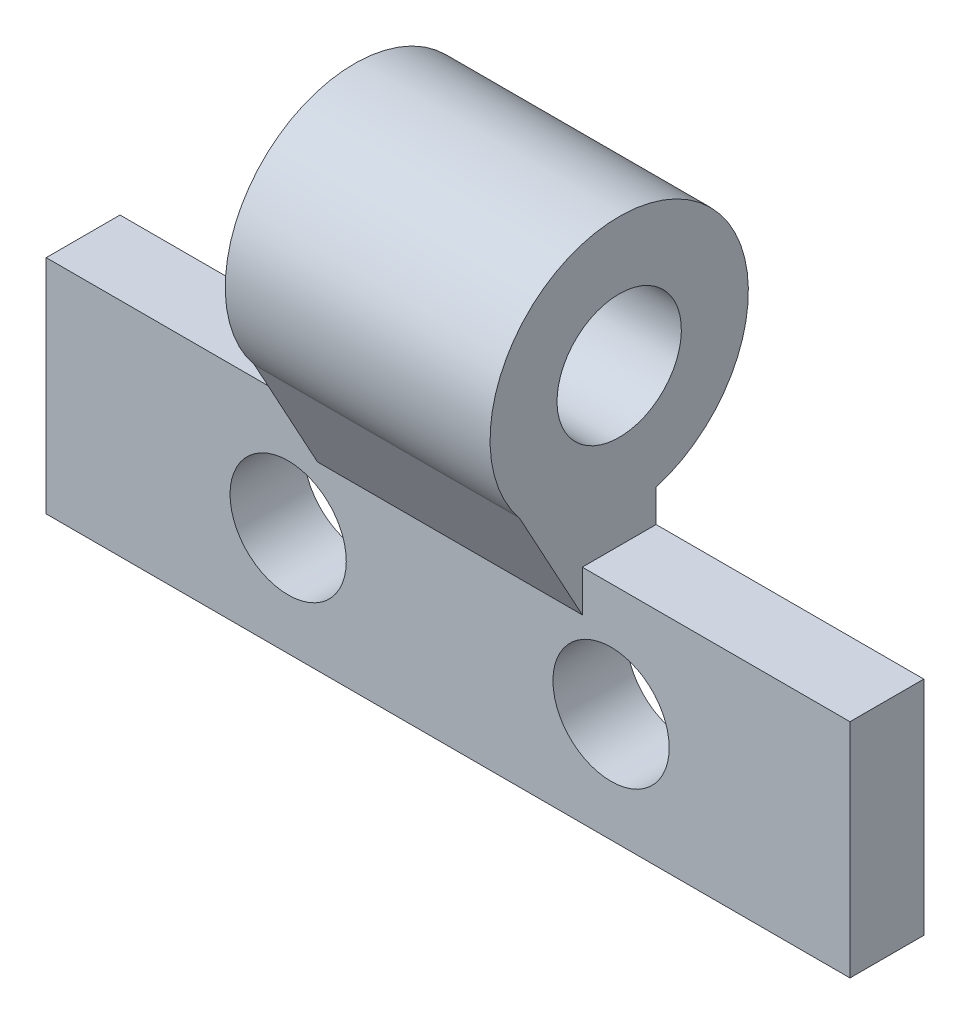
ISO-10303-21;
HEADER;
FILE_DESCRIPTION(('STEP AP214'),'2;1');
FILE_NAME('part.step','',(''),(''),'','','');
FILE_SCHEMA(('AUTOMOTIVE_DESIGN { 1 0 10303 214 1 1 1 1 }'));
ENDSEC;
DATA;
#1=APPLICATION_CONTEXT('core data for automotive mechanical design processes');
#2=APPLICATION_PROTOCOL_DEFINITION('international standard','automotive_design',2000,#1);
#3=PRODUCT_CONTEXT('',#1,'mechanical');
#4=PRODUCT('Part','Part','',(#3));
#5=PRODUCT_RELATED_PRODUCT_CATEGORY('part','',(#4));
#6=PRODUCT_DEFINITION_FORMATION('','',#4);
#7=PRODUCT_DEFINITION_CONTEXT('part definition',#1,'design');
#8=PRODUCT_DEFINITION('design','',#6,#7);
#9=PRODUCT_DEFINITION_SHAPE('','',#8);
#10=(LENGTH_UNIT() NAMED_UNIT(*) SI_UNIT(.MILLI.,.METRE.));
#11=(NAMED_UNIT(*) PLANE_ANGLE_UNIT() SI_UNIT($,.RADIAN.));
#12=(NAMED_UNIT(*) SI_UNIT($,.STERADIAN.) SOLID_ANGLE_UNIT());
#13=UNCERTAINTY_MEASURE_WITH_UNIT(LENGTH_MEASURE(1.E-05),#10,'distance_accuracy_value','');
#14=(GEOMETRIC_REPRESENTATION_CONTEXT(3) GLOBAL_UNCERTAINTY_ASSIGNED_CONTEXT((#13)) GLOBAL_UNIT_ASSIGNED_CONTEXT((#10,
#11,#12)) REPRESENTATION_CONTEXT('',''));
#15=CARTESIAN_POINT('',(0.,0.,0.));
#16=DIRECTION('',(0.,0.,1.));
#17=DIRECTION('',(1.,0.,0.));
#18=AXIS2_PLACEMENT_3D('',#15,#16,#17);
#19=CARTESIAN_POINT('',(-24.27796875,7.59378125,2.286));
#20=DIRECTION('',(1.,0.,0.));
#21=DIRECTION('',(0.,0.,-1.));
#22=AXIS2_PLACEMENT_3D('',#19,#20,#21);
#23=PLANE('',#22);
#24=DIRECTION('',(0.,-1.,0.));
#25=VECTOR('',#24,1.);
#26=CARTESIAN_POINT('',(-24.27796875,7.59378125,2.286));
#27=LINE('',#26,#25);
#28=CARTESIAN_POINT('',(-24.27796875,6.59378125,2.286));
#29=VERTEX_POINT('',#28);
#30=CARTESIAN_POINT('',(-24.27796875,-0.28021875,2.286));
#31=VERTEX_POINT('',#30);
#32=EDGE_CURVE('E130',#29,#31,#27,.T.);
#33=ORIENTED_EDGE('',*,*,#32,.F.);
#34=DIRECTION('',(0.,0.,1.));
#35=VECTOR('',#34,1.);
#36=CARTESIAN_POINT('',(-24.27796875,6.59378125,0.));
#37=LINE('',#36,#35);
#38=CARTESIAN_POINT('',(-24.27796875,6.59378125,0.));
#39=VERTEX_POINT('',#38);
#40=EDGE_CURVE('E168',#39,#29,#37,.T.);
#41=ORIENTED_EDGE('',*,*,#40,.F.);
#42=DIRECTION('',(0.,-1.,0.));
#43=VECTOR('',#42,1.);
#44=CARTESIAN_POINT('',(-24.27796875,7.59378125,0.));
#45=LINE('',#44,#43);
#46=CARTESIAN_POINT('',(-24.27796875,-0.28021875,0.));
#47=VERTEX_POINT('',#46);
#48=EDGE_CURVE('E132',#39,#47,#45,.T.);
#49=ORIENTED_EDGE('',*,*,#48,.T.);
#50=DIRECTION('',(0.,0.,-1.));
#51=VECTOR('',#50,1.);
#52=CARTESIAN_POINT('',(-24.27796875,-0.28021875,2.286));
#53=LINE('',#52,#51);
#54=EDGE_CURVE('E137',#31,#47,#53,.T.);
#55=ORIENTED_EDGE('',*,*,#54,.F.);
#56=EDGE_LOOP('',(#33,#41,#49,#55));
#57=FACE_BOUND('',#56,.T.);
#58=ADVANCED_FACE('F33',(#57),#23,.F.);
#59=CARTESIAN_POINT('',(-24.27796875,-0.28021875,2.286));
#60=DIRECTION('',(0.,1.,0.));
#61=DIRECTION('',(0.,0.,1.));
#62=AXIS2_PLACEMENT_3D('',#59,#60,#61);
#63=PLANE('',#62);
#64=DIRECTION('',(1.,0.,0.));
#65=VECTOR('',#64,1.);
#66=CARTESIAN_POINT('',(-24.27796875,-0.28021875,0.));
#67=LINE('',#66,#65);
#68=CARTESIAN_POINT('',(0.61403125,-0.28021875,0.));
#69=VERTEX_POINT('',#68);
#70=EDGE_CURVE('E128',#47,#69,#67,.T.);
#71=ORIENTED_EDGE('',*,*,#70,.T.);
#72=DIRECTION('',(0.,0.,-1.));
#73=VECTOR('',#72,1.);
#74=CARTESIAN_POINT('',(0.61403125,-0.28021875,2.286));
#75=LINE('',#74,#73);
#76=CARTESIAN_POINT('',(0.61403125,-0.28021875,2.286));
#77=VERTEX_POINT('',#76);
#78=EDGE_CURVE('E125',#77,#69,#75,.T.);
#79=ORIENTED_EDGE('',*,*,#78,.F.);
#80=DIRECTION('',(1.,0.,0.));
#81=VECTOR('',#80,1.);
#82=CARTESIAN_POINT('',(-24.27796875,-0.28021875,2.286));
#83=LINE('',#82,#81);
#84=EDGE_CURVE('E174',#31,#77,#83,.T.);
#85=ORIENTED_EDGE('',*,*,#84,.F.);
#86=ORIENTED_EDGE('',*,*,#54,.T.);
#87=EDGE_LOOP('',(#71,#79,#85,#86));
#88=FACE_BOUND('',#87,.T.);
#89=ADVANCED_FACE('F214',(#88),#63,.F.);
#90=CARTESIAN_POINT('',(0.614031249999999,7.59378125,2.286));
#91=DIRECTION('',(1.,0.,0.));
#92=DIRECTION('',(0.,1.,0.));
#93=AXIS2_PLACEMENT_3D('',#90,#91,#92);
#94=PLANE('',#93);
#95=DIRECTION('',(0.,0.,-1.));
#96=VECTOR('',#95,1.);
#97=CARTESIAN_POINT('',(0.614031249999999,6.59378125,0.));
#98=LINE('',#97,#96);
#99=CARTESIAN_POINT('',(0.614031249999999,6.59378125,2.286));
#100=VERTEX_POINT('',#99);
#101=CARTESIAN_POINT('',(0.614031249999999,6.59378125,0.));
#102=VERTEX_POINT('',#101);
#103=EDGE_CURVE('E104',#100,#102,#98,.T.);
#104=ORIENTED_EDGE('',*,*,#103,.F.);
#105=DIRECTION('',(0.,-1.,0.));
#106=VECTOR('',#105,1.);
#107=CARTESIAN_POINT('',(0.614031249999999,7.59378125,2.286));
#108=LINE('',#107,#106);
#109=EDGE_CURVE('E138',#100,#77,#108,.T.);
#110=ORIENTED_EDGE('',*,*,#109,.T.);
#111=ORIENTED_EDGE('',*,*,#78,.T.);
#112=DIRECTION('',(0.,-1.,0.));
#113=VECTOR('',#112,1.);
#114=CARTESIAN_POINT('',(0.614031249999999,7.59378125,0.));
#115=LINE('',#114,#113);
#116=EDGE_CURVE('E118',#102,#69,#115,.T.);
#117=ORIENTED_EDGE('',*,*,#116,.F.);
#118=EDGE_LOOP('',(#104,#110,#111,#117));
#119=FACE_BOUND('',#118,.T.);
#120=ADVANCED_FACE('F123',(#119),#94,.T.);
#121=CARTESIAN_POINT('',(0.,0.,2.286));
#122=DIRECTION('',(0.,0.,1.));
#123=DIRECTION('',(1.,0.,0.));
#124=AXIS2_PLACEMENT_3D('',#121,#122,#123);
#125=PLANE('',#124);
#126=DIRECTION('',(1.,0.,0.));
#127=VECTOR('',#126,1.);
#128=CARTESIAN_POINT('',(0.614031249999999,6.59378125,2.286));
#129=LINE('',#128,#127);
#130=CARTESIAN_POINT('',(-7.67596875,6.59378125,2.286));
#131=VERTEX_POINT('',#130);
#132=EDGE_CURVE('E109',#131,#100,#129,.T.);
#133=ORIENTED_EDGE('',*,*,#132,.F.);
#134=DIRECTION('',(0.,-1.,0.));
#135=VECTOR('',#134,1.);
#136=CARTESIAN_POINT('',(-7.67596875,11.42699804533,2.286));
#137=LINE('',#136,#135);
#138=CARTESIAN_POINT('',(-7.67596875,5.31402242838248,2.286));
#139=VERTEX_POINT('',#138);
#140=EDGE_CURVE('E48',#131,#139,#137,.T.);
#141=ORIENTED_EDGE('',*,*,#140,.T.);
#142=DIRECTION('',(-1.,0.,0.));
#143=VECTOR('',#142,1.);
#144=CARTESIAN_POINT('',(-15.87596875,5.31402242838248,2.286));
#145=LINE('',#144,#143);
#146=CARTESIAN_POINT('',(-15.87596875,5.31402242838248,2.286));
#147=VERTEX_POINT('',#146);
#148=EDGE_CURVE('E145',#139,#147,#145,.T.);
#149=ORIENTED_EDGE('',*,*,#148,.T.);
#150=DIRECTION('',(0.,1.,0.));
#151=VECTOR('',#150,1.);
#152=CARTESIAN_POINT('',(-15.87596875,0.,2.286));
#153=LINE('',#152,#151);
#154=CARTESIAN_POINT('',(-15.87596875,6.59378125,2.286));
#155=VERTEX_POINT('',#154);
#156=EDGE_CURVE('E55',#147,#155,#153,.T.);
#157=ORIENTED_EDGE('',*,*,#156,.T.);
#158=DIRECTION('',(1.,0.,0.));
#159=VECTOR('',#158,1.);
#160=CARTESIAN_POINT('',(-15.87596875,6.59378125,2.286));
#161=LINE('',#160,#159);
#162=EDGE_CURVE('E161',#29,#155,#161,.T.);
#163=ORIENTED_EDGE('',*,*,#162,.F.);
#164=ORIENTED_EDGE('',*,*,#32,.T.);
#165=ORIENTED_EDGE('',*,*,#84,.T.);
#166=ORIENTED_EDGE('',*,*,#109,.F.);
#167=EDGE_LOOP('',(#133,#141,#149,#157,#163,#164,#165,#166));
#168=FACE_BOUND('',#167,.T.);
#169=CARTESIAN_POINT('',(-16.78496875,3.09378125,2.286));
#170=DIRECTION('',(0.,0.,1.));
#171=DIRECTION('',(1.,0.,0.));
#172=AXIS2_PLACEMENT_3D('',#169,#170,#171);
#173=CIRCLE('',#172,1.8);
#174=CARTESIAN_POINT('',(-14.98496875,3.09378125,2.286));
#175=VERTEX_POINT('',#174);
#176=EDGE_CURVE('E186',#175,#175,#173,.T.);
#177=ORIENTED_EDGE('',*,*,#176,.F.);
#178=EDGE_LOOP('',(#177));
#179=FACE_BOUND('',#178,.T.);
#180=CARTESIAN_POINT('',(-6.78496875,3.09378125,2.286));
#181=DIRECTION('',(0.,0.,1.));
#182=DIRECTION('',(1.,0.,0.));
#183=AXIS2_PLACEMENT_3D('',#180,#181,#182);
#184=CIRCLE('',#183,1.8);
#185=CARTESIAN_POINT('',(-4.98496875,3.09378125,2.286));
#186=VERTEX_POINT('',#185);
#187=EDGE_CURVE('E178',#186,#186,#184,.T.);
#188=ORIENTED_EDGE('',*,*,#187,.F.);
#189=EDGE_LOOP('',(#188));
#190=FACE_BOUND('',#189,.T.);
#191=ADVANCED_FACE('F157',(#168,#179,#190),#125,.T.);
#192=CARTESIAN_POINT('',(0.,0.,0.));
#193=DIRECTION('',(0.,0.,1.));
#194=DIRECTION('',(1.,0.,0.));
#195=AXIS2_PLACEMENT_3D('',#192,#193,#194);
#196=PLANE('',#195);
#197=CARTESIAN_POINT('',(-16.78496875,3.09378125,0.));
#198=DIRECTION('',(0.,0.,-1.));
#199=DIRECTION('',(-1.,0.,0.));
#200=AXIS2_PLACEMENT_3D('',#197,#198,#199);
#201=CIRCLE('',#200,1.8);
#202=CARTESIAN_POINT('',(-18.58496875,3.09378125,0.));
#203=VERTEX_POINT('',#202);
#204=EDGE_CURVE('E190',#203,#203,#201,.T.);
#205=ORIENTED_EDGE('',*,*,#204,.F.);
#206=EDGE_LOOP('',(#205));
#207=FACE_BOUND('',#206,.T.);
#208=CARTESIAN_POINT('',(-6.78496875,3.09378125,0.));
#209=DIRECTION('',(0.,0.,-1.));
#210=DIRECTION('',(-1.,0.,0.));
#211=AXIS2_PLACEMENT_3D('',#208,#209,#210);
#212=CIRCLE('',#211,1.8);
#213=CARTESIAN_POINT('',(-8.58496875,3.09378125,0.));
#214=VERTEX_POINT('',#213);
#215=EDGE_CURVE('E182',#214,#214,#212,.T.);
#216=ORIENTED_EDGE('',*,*,#215,.F.);
#217=EDGE_LOOP('',(#216));
#218=FACE_BOUND('',#217,.T.);
#219=DIRECTION('',(1.,0.,0.));
#220=VECTOR('',#219,1.);
#221=CARTESIAN_POINT('',(-24.27796875,7.59378125,0.));
#222=LINE('',#221,#220);
#223=CARTESIAN_POINT('',(-15.87596875,7.59378125,0.));
#224=VERTEX_POINT('',#223);
#225=CARTESIAN_POINT('',(-7.67596875000001,7.59378125,0.));
#226=VERTEX_POINT('',#225);
#227=EDGE_CURVE('E127',#224,#226,#222,.T.);
#228=ORIENTED_EDGE('',*,*,#227,.T.);
#229=DIRECTION('',(0.,1.,0.));
#230=VECTOR('',#229,1.);
#231=CARTESIAN_POINT('',(-7.67596875,6.59378125,0.));
#232=LINE('',#231,#230);
#233=CARTESIAN_POINT('',(-7.67596875,6.59378125,0.));
#234=VERTEX_POINT('',#233);
#235=EDGE_CURVE('E120',#234,#226,#232,.T.);
#236=ORIENTED_EDGE('',*,*,#235,.F.);
#237=DIRECTION('',(-1.,0.,0.));
#238=VECTOR('',#237,1.);
#239=CARTESIAN_POINT('',(0.614031249999999,6.59378125,0.));
#240=LINE('',#239,#238);
#241=EDGE_CURVE('E107',#102,#234,#240,.T.);
#242=ORIENTED_EDGE('',*,*,#241,.F.);
#243=ORIENTED_EDGE('',*,*,#116,.T.);
#244=ORIENTED_EDGE('',*,*,#70,.F.);
#245=ORIENTED_EDGE('',*,*,#48,.F.);
#246=DIRECTION('',(-1.,0.,0.));
#247=VECTOR('',#246,1.);
#248=CARTESIAN_POINT('',(-15.87596875,6.59378125,0.));
#249=LINE('',#248,#247);
#250=CARTESIAN_POINT('',(-15.87596875,6.59378125,0.));
#251=VERTEX_POINT('',#250);
#252=EDGE_CURVE('E207',#251,#39,#249,.T.);
#253=ORIENTED_EDGE('',*,*,#252,.F.);
#254=DIRECTION('',(0.,1.,0.));
#255=VECTOR('',#254,1.);
#256=CARTESIAN_POINT('',(-15.87596875,6.59378125,0.));
#257=LINE('',#256,#255);
#258=EDGE_CURVE('E167',#251,#224,#257,.T.);
#259=ORIENTED_EDGE('',*,*,#258,.T.);
#260=EDGE_LOOP('',(#228,#236,#242,#243,#244,#245,#253,#259));
#261=FACE_BOUND('',#260,.T.);
#262=ADVANCED_FACE('F116',(#207,#218,#261),#196,.F.);
#263=CARTESIAN_POINT('',(-6.78496875,3.09378125,8.29));
#264=DIRECTION('',(0.,0.,-1.));
#265=DIRECTION('',(-1.,0.,0.));
#266=AXIS2_PLACEMENT_3D('',#263,#264,#265);
#267=CYLINDRICAL_SURFACE('',#266,1.8);
#268=ORIENTED_EDGE('',*,*,#187,.T.);
#269=EDGE_LOOP('',(#268));
#270=FACE_BOUND('',#269,.T.);
#271=ORIENTED_EDGE('',*,*,#215,.T.);
#272=EDGE_LOOP('',(#271));
#273=FACE_BOUND('',#272,.T.);
#274=ADVANCED_FACE('F231',(#270,#273),#267,.F.);
#275=CARTESIAN_POINT('',(-16.78496875,3.09378125,8.29));
#276=DIRECTION('',(0.,0.,-1.));
#277=DIRECTION('',(-1.,0.,0.));
#278=AXIS2_PLACEMENT_3D('',#275,#276,#277);
#279=CYLINDRICAL_SURFACE('',#278,1.8);
#280=ORIENTED_EDGE('',*,*,#176,.T.);
#281=EDGE_LOOP('',(#280));
#282=FACE_BOUND('',#281,.T.);
#283=ORIENTED_EDGE('',*,*,#204,.T.);
#284=EDGE_LOOP('',(#283));
#285=FACE_BOUND('',#284,.T.);
#286=ADVANCED_FACE('F224',(#282,#285),#279,.F.);
#287=CARTESIAN_POINT('',(-15.87596875,11.42699804533,1.143));
#288=DIRECTION('',(1.,0.,0.));
#289=DIRECTION('',(0.,1.,0.));
#290=AXIS2_PLACEMENT_3D('',#287,#288,#289);
#291=CYLINDRICAL_SURFACE('',#290,4.);
#292=CARTESIAN_POINT('',(-15.87596875,11.42699804533,1.143));
#293=DIRECTION('',(1.,0.,0.));
#294=DIRECTION('',(0.,1.,0.));
#295=AXIS2_PLACEMENT_3D('',#292,#293,#294);
#296=CIRCLE('',#295,4.);
#297=CARTESIAN_POINT('',(-15.87596875,8.88905951006865,4.23474190242903));
#298=VERTEX_POINT('',#297);
#299=EDGE_CURVE('E195',#224,#298,#296,.T.);
#300=ORIENTED_EDGE('',*,*,#299,.T.);
#301=DIRECTION('',(1.,0.,0.));
#302=VECTOR('',#301,1.);
#303=CARTESIAN_POINT('',(-15.87596875,8.88905951006865,4.23474190242903));
#304=LINE('',#303,#302);
#305=CARTESIAN_POINT('',(-7.67596875,8.88905951006865,4.23474190242903));
#306=VERTEX_POINT('',#305);
#307=EDGE_CURVE('E141',#298,#306,#304,.T.);
#308=ORIENTED_EDGE('',*,*,#307,.T.);
#309=CARTESIAN_POINT('',(-7.67596875,11.42699804533,1.143));
#310=DIRECTION('',(1.,0.,0.));
#311=DIRECTION('',(0.,1.,0.));
#312=AXIS2_PLACEMENT_3D('',#309,#310,#311);
#313=CIRCLE('',#312,4.);
#314=EDGE_CURVE('E153',#226,#306,#313,.T.);
#315=ORIENTED_EDGE('',*,*,#314,.F.);
#316=ORIENTED_EDGE('',*,*,#227,.F.);
#317=EDGE_LOOP('',(#300,#308,#315,#316));
#318=FACE_BOUND('',#317,.T.);
#319=ADVANCED_FACE('F222',(#318),#291,.T.);
#320=CARTESIAN_POINT('',(-15.87596875,11.42699804533,1.143));
#321=DIRECTION('',(1.,0.,0.));
#322=DIRECTION('',(0.,1.,0.));
#323=AXIS2_PLACEMENT_3D('',#320,#321,#322);
#324=PLANE('',#323);
#325=ORIENTED_EDGE('',*,*,#299,.F.);
#326=ORIENTED_EDGE('',*,*,#258,.F.);
#327=DIRECTION('',(0.,0.,-1.));
#328=VECTOR('',#327,1.);
#329=CARTESIAN_POINT('',(-15.87596875,6.59378125,0.));
#330=LINE('',#329,#328);
#331=EDGE_CURVE('E209',#155,#251,#330,.T.);
#332=ORIENTED_EDGE('',*,*,#331,.F.);
#333=ORIENTED_EDGE('',*,*,#156,.F.);
#334=DIRECTION('',(0.,0.87802752098549,0.478610146561974));
#335=VECTOR('',#334,1.);
#336=CARTESIAN_POINT('',(-15.87596875,9.54638676694989,4.59304900241834));
#337=LINE('',#336,#335);
#338=EDGE_CURVE('E11',#147,#298,#337,.T.);
#339=ORIENTED_EDGE('',*,*,#338,.T.);
#340=EDGE_LOOP('',(#325,#326,#332,#333,#339));
#341=FACE_BOUND('',#340,.T.);
#342=CARTESIAN_POINT('',(-15.87596875,11.42699804533,1.143));
#343=DIRECTION('',(1.,0.,0.));
#344=DIRECTION('',(0.,1.,0.));
#345=AXIS2_PLACEMENT_3D('',#342,#343,#344);
#346=CIRCLE('',#345,1.925);
#347=CARTESIAN_POINT('',(-15.87596875,13.35199804533,1.143));
#348=VERTEX_POINT('',#347);
#349=EDGE_CURVE('E197',#348,#348,#346,.T.);
#350=ORIENTED_EDGE('',*,*,#349,.T.);
#351=EDGE_LOOP('',(#350));
#352=FACE_BOUND('',#351,.T.);
#353=ADVANCED_FACE('F219',(#341,#352),#324,.F.);
#354=CARTESIAN_POINT('',(-7.67596875,11.42699804533,1.143));
#355=DIRECTION('',(1.,0.,0.));
#356=DIRECTION('',(0.,1.,0.));
#357=AXIS2_PLACEMENT_3D('',#354,#355,#356);
#358=PLANE('',#357);
#359=ORIENTED_EDGE('',*,*,#140,.F.);
#360=DIRECTION('',(0.,0.,1.));
#361=VECTOR('',#360,1.);
#362=CARTESIAN_POINT('',(-7.67596875,6.59378125,0.));
#363=LINE('',#362,#361);
#364=EDGE_CURVE('E121',#234,#131,#363,.T.);
#365=ORIENTED_EDGE('',*,*,#364,.F.);
#366=ORIENTED_EDGE('',*,*,#235,.T.);
#367=ORIENTED_EDGE('',*,*,#314,.T.);
#368=DIRECTION('',(0.,-0.87802752098549,-0.478610146561974));
#369=VECTOR('',#368,1.);
#370=CARTESIAN_POINT('',(-7.67596875,8.88905951006866,4.23474190242903));
#371=LINE('',#370,#369);
#372=EDGE_CURVE('E41',#306,#139,#371,.T.);
#373=ORIENTED_EDGE('',*,*,#372,.T.);
#374=EDGE_LOOP('',(#359,#365,#366,#367,#373));
#375=FACE_BOUND('',#374,.T.);
#376=CARTESIAN_POINT('',(-7.67596875,11.42699804533,1.143));
#377=DIRECTION('',(1.,0.,0.));
#378=DIRECTION('',(0.,1.,0.));
#379=AXIS2_PLACEMENT_3D('',#376,#377,#378);
#380=CIRCLE('',#379,1.925);
#381=CARTESIAN_POINT('',(-7.67596875,13.35199804533,1.143));
#382=VERTEX_POINT('',#381);
#383=EDGE_CURVE('E200',#382,#382,#380,.T.);
#384=ORIENTED_EDGE('',*,*,#383,.F.);
#385=EDGE_LOOP('',(#384));
#386=FACE_BOUND('',#385,.T.);
#387=ADVANCED_FACE('F150',(#375,#386),#358,.T.);
#388=CARTESIAN_POINT('',(-15.87596875,11.42699804533,1.143));
#389=DIRECTION('',(1.,0.,0.));
#390=DIRECTION('',(0.,1.,0.));
#391=AXIS2_PLACEMENT_3D('',#388,#389,#390);
#392=CYLINDRICAL_SURFACE('',#391,1.925);
#393=ORIENTED_EDGE('',*,*,#349,.F.);
#394=EDGE_LOOP('',(#393));
#395=FACE_BOUND('',#394,.T.);
#396=ORIENTED_EDGE('',*,*,#383,.T.);
#397=EDGE_LOOP('',(#396));
#398=FACE_BOUND('',#397,.T.);
#399=ADVANCED_FACE('F264',(#395,#398),#392,.F.);
#400=CARTESIAN_POINT('',(-15.87596875,8.88905951006865,4.23474190242903));
#401=DIRECTION('',(0.,0.478610146561974,-0.87802752098549));
#402=DIRECTION('',(1.,0.,0.));
#403=AXIS2_PLACEMENT_3D('',#400,#401,#402);
#404=PLANE('',#403);
#405=ORIENTED_EDGE('',*,*,#338,.F.);
#406=ORIENTED_EDGE('',*,*,#148,.F.);
#407=ORIENTED_EDGE('',*,*,#372,.F.);
#408=ORIENTED_EDGE('',*,*,#307,.F.);
#409=EDGE_LOOP('',(#405,#406,#407,#408));
#410=FACE_BOUND('',#409,.T.);
#411=ADVANCED_FACE('F35',(#410),#404,.F.);
#412=CARTESIAN_POINT('',(0.,6.59378125,0.));
#413=DIRECTION('',(0.,-1.,0.));
#414=DIRECTION('',(0.,0.,-1.));
#415=AXIS2_PLACEMENT_3D('',#412,#413,#414);
#416=PLANE('',#415);
#417=ORIENTED_EDGE('',*,*,#331,.T.);
#418=ORIENTED_EDGE('',*,*,#252,.T.);
#419=ORIENTED_EDGE('',*,*,#40,.T.);
#420=ORIENTED_EDGE('',*,*,#162,.T.);
#421=EDGE_LOOP('',(#417,#418,#419,#420));
#422=FACE_BOUND('',#421,.T.);
#423=ADVANCED_FACE('F217',(#422),#416,.F.);
#424=CARTESIAN_POINT('',(0.,6.59378125,0.));
#425=DIRECTION('',(0.,-1.,0.));
#426=DIRECTION('',(0.,0.,-1.));
#427=AXIS2_PLACEMENT_3D('',#424,#425,#426);
#428=PLANE('',#427);
#429=ORIENTED_EDGE('',*,*,#103,.T.);
#430=ORIENTED_EDGE('',*,*,#241,.T.);
#431=ORIENTED_EDGE('',*,*,#364,.T.);
#432=ORIENTED_EDGE('',*,*,#132,.T.);
#433=EDGE_LOOP('',(#429,#430,#431,#432));
#434=FACE_BOUND('',#433,.T.);
#435=ADVANCED_FACE('F106',(#434),#428,.F.);
#436=CLOSED_SHELL('',(#58,#89,#120,#191,#262,#274,#286,#319,#353,#387,#399,#411,#423,#435));
#437=MANIFOLD_SOLID_BREP('B2',#436);
#438=ADVANCED_BREP_SHAPE_REPRESENTATION('',(#18,#437),#14);
#439=SHAPE_DEFINITION_REPRESENTATION(#9,#438);
ENDSEC;
END-ISO-10303-21;
